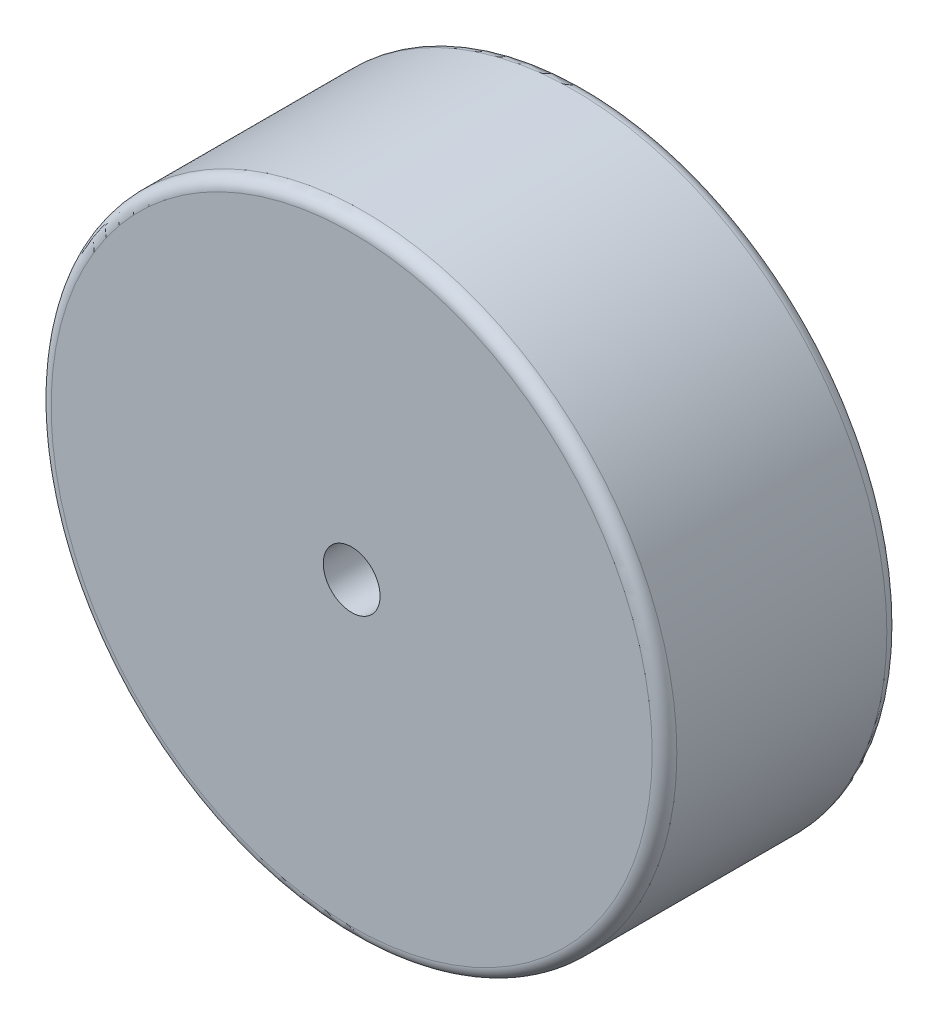
ISO-10303-21;
HEADER;
FILE_DESCRIPTION(('STEP AP214'),'2;1');
FILE_NAME('part.step','',(''),(''),'','','');
FILE_SCHEMA(('AUTOMOTIVE_DESIGN { 1 0 10303 214 1 1 1 1 }'));
ENDSEC;
DATA;
#1=APPLICATION_CONTEXT('core data for automotive mechanical design processes');
#2=APPLICATION_PROTOCOL_DEFINITION('international standard','automotive_design',2000,#1);
#3=PRODUCT_CONTEXT('',#1,'mechanical');
#4=PRODUCT('Part','Part','',(#3));
#5=PRODUCT_RELATED_PRODUCT_CATEGORY('part','',(#4));
#6=PRODUCT_DEFINITION_FORMATION('','',#4);
#7=PRODUCT_DEFINITION_CONTEXT('part definition',#1,'design');
#8=PRODUCT_DEFINITION('design','',#6,#7);
#9=PRODUCT_DEFINITION_SHAPE('','',#8);
#10=(LENGTH_UNIT() NAMED_UNIT(*) SI_UNIT(.MILLI.,.METRE.));
#11=(NAMED_UNIT(*) PLANE_ANGLE_UNIT() SI_UNIT($,.RADIAN.));
#12=(NAMED_UNIT(*) SI_UNIT($,.STERADIAN.) SOLID_ANGLE_UNIT());
#13=UNCERTAINTY_MEASURE_WITH_UNIT(LENGTH_MEASURE(1.E-05),#10,'distance_accuracy_value','');
#14=(GEOMETRIC_REPRESENTATION_CONTEXT(3) GLOBAL_UNCERTAINTY_ASSIGNED_CONTEXT((#13)) GLOBAL_UNIT_ASSIGNED_CONTEXT((#10,
#11,#12)) REPRESENTATION_CONTEXT('',''));
#15=CARTESIAN_POINT('',(0.,0.,0.));
#16=DIRECTION('',(0.,0.,1.));
#17=DIRECTION('',(1.,0.,0.));
#18=AXIS2_PLACEMENT_3D('',#15,#16,#17);
#19=CARTESIAN_POINT('',(0.,0.,9.525));
#20=DIRECTION('',(0.,0.,-1.));
#21=DIRECTION('',(-1.,0.,0.));
#22=AXIS2_PLACEMENT_3D('',#19,#20,#21);
#23=CYLINDRICAL_SURFACE('',#22,25.4);
#24=CARTESIAN_POINT('',(0.,0.,-8.525));
#25=DIRECTION('',(0.,0.,1.));
#26=DIRECTION('',(1.,0.,0.));
#27=AXIS2_PLACEMENT_3D('',#24,#25,#26);
#28=CIRCLE('',#27,25.4);
#29=CARTESIAN_POINT('',(-25.4,0.,-8.52500000000001));
#30=VERTEX_POINT('',#29);
#31=EDGE_CURVE('E56',#30,#30,#28,.T.);
#32=CARTESIAN_POINT('',(0.,0.,8.525));
#33=DIRECTION('',(0.,0.,1.));
#34=DIRECTION('',(1.,0.,0.));
#35=AXIS2_PLACEMENT_3D('',#32,#33,#34);
#36=CIRCLE('',#35,25.4);
#37=CARTESIAN_POINT('',(-25.4,0.,8.525));
#38=VERTEX_POINT('',#37);
#39=EDGE_CURVE('E61',#38,#38,#36,.F.);
#40=CARTESIAN_POINT('',(-25.4,0.,-8.52500000000001));
#41=CARTESIAN_POINT('',(-25.4,0.,-8.34739583333334));
#42=CARTESIAN_POINT('',(-25.4,0.,-8.16979166666667));
#43=CARTESIAN_POINT('',(-25.4,0.,-7.81458333333334));
#44=CARTESIAN_POINT('',(-25.4,0.,-7.63697916666667));
#45=CARTESIAN_POINT('',(-25.4,0.,-7.28177083333334));
#46=CARTESIAN_POINT('',(-25.4,0.,-7.10416666666667));
#47=CARTESIAN_POINT('',(-25.4,0.,-6.74895833333334));
#48=CARTESIAN_POINT('',(-25.4,0.,-6.57135416666667));
#49=CARTESIAN_POINT('',(-25.4,0.,-6.21614583333334));
#50=CARTESIAN_POINT('',(-25.4,0.,-6.03854166666667));
#51=CARTESIAN_POINT('',(-25.4,0.,-5.68333333333334));
#52=CARTESIAN_POINT('',(-25.4,0.,-5.50572916666667));
#53=CARTESIAN_POINT('',(-25.4,0.,-5.15052083333334));
#54=CARTESIAN_POINT('',(-25.4,0.,-4.97291666666667));
#55=CARTESIAN_POINT('',(-25.4,0.,-4.61770833333334));
#56=CARTESIAN_POINT('',(-25.4,0.,-4.44010416666667));
#57=CARTESIAN_POINT('',(-25.4,0.,-4.08489583333334));
#58=CARTESIAN_POINT('',(-25.4,0.,-3.90729166666667));
#59=CARTESIAN_POINT('',(-25.4,0.,-3.55208333333334));
#60=CARTESIAN_POINT('',(-25.4,0.,-3.37447916666667));
#61=CARTESIAN_POINT('',(-25.4,0.,-3.01927083333334));
#62=CARTESIAN_POINT('',(-25.4,0.,-2.84166666666667));
#63=CARTESIAN_POINT('',(-25.4,0.,-2.48645833333334));
#64=CARTESIAN_POINT('',(-25.4,0.,-2.30885416666667));
#65=CARTESIAN_POINT('',(-25.4,0.,-1.95364583333334));
#66=CARTESIAN_POINT('',(-25.4,0.,-1.77604166666667));
#67=CARTESIAN_POINT('',(-25.4,0.,-1.42083333333334));
#68=CARTESIAN_POINT('',(-25.4,0.,-1.24322916666667));
#69=CARTESIAN_POINT('',(-25.4,0.,-0.888020833333337));
#70=CARTESIAN_POINT('',(-25.4,0.,-0.71041666666667));
#71=CARTESIAN_POINT('',(-25.4,0.,-0.355208333333337));
#72=CARTESIAN_POINT('',(-25.4,0.,-0.17760416666667));
#73=CARTESIAN_POINT('',(-25.4,0.,0.177604166666663));
#74=CARTESIAN_POINT('',(-25.4,0.,0.35520833333333));
#75=CARTESIAN_POINT('',(-25.4,0.,0.710416666666664));
#76=CARTESIAN_POINT('',(-25.4,0.,0.88802083333333));
#77=CARTESIAN_POINT('',(-25.4,0.,1.24322916666666));
#78=CARTESIAN_POINT('',(-25.4,0.,1.42083333333333));
#79=CARTESIAN_POINT('',(-25.4,0.,1.77604166666666));
#80=CARTESIAN_POINT('',(-25.4,0.,1.95364583333333));
#81=CARTESIAN_POINT('',(-25.4,0.,2.30885416666666));
#82=CARTESIAN_POINT('',(-25.4,0.,2.48645833333333));
#83=CARTESIAN_POINT('',(-25.4,0.,2.84166666666666));
#84=CARTESIAN_POINT('',(-25.4,0.,3.01927083333333));
#85=CARTESIAN_POINT('',(-25.4,0.,3.37447916666666));
#86=CARTESIAN_POINT('',(-25.4,0.,3.55208333333333));
#87=CARTESIAN_POINT('',(-25.4,0.,3.90729166666666));
#88=CARTESIAN_POINT('',(-25.4,0.,4.08489583333333));
#89=CARTESIAN_POINT('',(-25.4,0.,4.44010416666667));
#90=CARTESIAN_POINT('',(-25.4,0.,4.61770833333333));
#91=CARTESIAN_POINT('',(-25.4,0.,4.97291666666667));
#92=CARTESIAN_POINT('',(-25.4,0.,5.15052083333333));
#93=CARTESIAN_POINT('',(-25.4,0.,5.50572916666667));
#94=CARTESIAN_POINT('',(-25.4,0.,5.68333333333333));
#95=CARTESIAN_POINT('',(-25.4,0.,6.03854166666667));
#96=CARTESIAN_POINT('',(-25.4,0.,6.21614583333333));
#97=CARTESIAN_POINT('',(-25.4,0.,6.57135416666667));
#98=CARTESIAN_POINT('',(-25.4,0.,6.74895833333333));
#99=CARTESIAN_POINT('',(-25.4,0.,7.10416666666667));
#100=CARTESIAN_POINT('',(-25.4,0.,7.28177083333333));
#101=CARTESIAN_POINT('',(-25.4,0.,7.63697916666667));
#102=CARTESIAN_POINT('',(-25.4,0.,7.81458333333333));
#103=CARTESIAN_POINT('',(-25.4,0.,8.16979166666667));
#104=CARTESIAN_POINT('',(-25.4,0.,8.34739583333333));
#105=CARTESIAN_POINT('',(-25.4,0.,8.525));
#106=B_SPLINE_CURVE_WITH_KNOTS('',3,(#40,#41,#42,#43,#44,#45,#46,#47,#48,#49,#50,#51,#52,#53,
#54,#55,#56,#57,#58,#59,#60,#61,#62,#63,#64,#65,#66,#67,#68,#69,#70,#71,#72,#73,#74,#75,#76,#77,
#78,#79,#80,#81,#82,#83,#84,#85,#86,#87,#88,#89,#90,#91,#92,#93,#94,#95,#96,#97,#98,#99,#100,
#101,#102,#103,#104,#105),.UNSPECIFIED.,.F.,.F.,(4,2,2,2,2,2,2,2,2,2,2,2,2,2,2,2,2,2,2,2,2,2,2,
2,2,2,2,2,2,2,2,2,4),(0.,0.5328125,1.065625,1.5984375,2.13125,2.6640625,3.196875,3.7296875,
4.2625,4.7953125,5.328125,5.8609375,6.39375,6.9265625,7.459375,7.9921875,8.525,9.0578125,
9.590625,10.1234375,10.65625,11.1890625,11.721875,12.2546875,12.7875,13.3203125,13.853125,
14.3859375,14.91875,15.4515625,15.984375,16.5171875,17.05),.UNSPECIFIED.);
#107=EDGE_CURVE('BSEAM43',#30,#38,#106,.T.);
#108=ORIENTED_EDGE('',*,*,#31,.T.);
#109=ORIENTED_EDGE('',*,*,#39,.T.);
#110=ORIENTED_EDGE('',*,*,#107,.T.);
#111=ORIENTED_EDGE('',*,*,#107,.F.);
#112=EDGE_LOOP('',(#108,#110,#109,#111));
#113=FACE_BOUND('',#112,.T.);
#114=ADVANCED_FACE('F43',(#113),#23,.T.);
#115=CARTESIAN_POINT('',(0.,0.,9.525));
#116=DIRECTION('',(0.,0.,1.));
#117=DIRECTION('',(1.,0.,0.));
#118=AXIS2_PLACEMENT_3D('',#115,#116,#117);
#119=PLANE('',#118);
#120=CARTESIAN_POINT('',(0.,0.,9.525));
#121=DIRECTION('',(0.,0.,1.));
#122=DIRECTION('',(1.,0.,0.));
#123=AXIS2_PLACEMENT_3D('',#120,#121,#122);
#124=CIRCLE('',#123,2.305);
#125=CARTESIAN_POINT('',(2.305,0.,9.525));
#126=VERTEX_POINT('',#125);
#127=EDGE_CURVE('E68',#126,#126,#124,.T.);
#128=ORIENTED_EDGE('',*,*,#127,.F.);
#129=EDGE_LOOP('',(#128));
#130=FACE_BOUND('',#129,.T.);
#131=CARTESIAN_POINT('',(0.,0.,9.525));
#132=DIRECTION('',(0.,0.,1.));
#133=DIRECTION('',(1.,0.,0.));
#134=AXIS2_PLACEMENT_3D('',#131,#132,#133);
#135=CIRCLE('',#134,24.4);
#136=CARTESIAN_POINT('',(24.4,0.,9.525));
#137=VERTEX_POINT('',#136);
#138=EDGE_CURVE('E10',#137,#137,#135,.T.);
#139=ORIENTED_EDGE('',*,*,#138,.T.);
#140=EDGE_LOOP('',(#139));
#141=FACE_BOUND('',#140,.T.);
#142=ADVANCED_FACE('F84',(#130,#141),#119,.T.);
#143=CARTESIAN_POINT('',(0.,0.,-9.525));
#144=DIRECTION('',(0.,0.,1.));
#145=DIRECTION('',(1.,0.,0.));
#146=AXIS2_PLACEMENT_3D('',#143,#144,#145);
#147=PLANE('',#146);
#148=CARTESIAN_POINT('',(0.,0.,-9.525));
#149=DIRECTION('',(0.,0.,1.));
#150=DIRECTION('',(1.,0.,0.));
#151=AXIS2_PLACEMENT_3D('',#148,#149,#150);
#152=CIRCLE('',#151,24.4);
#153=CARTESIAN_POINT('',(24.4,0.,-9.525));
#154=VERTEX_POINT('',#153);
#155=EDGE_CURVE('E51',#154,#154,#152,.F.);
#156=ORIENTED_EDGE('',*,*,#155,.T.);
#157=EDGE_LOOP('',(#156));
#158=FACE_BOUND('',#157,.T.);
#159=ADVANCED_FACE('F86',(#158),#147,.F.);
#160=CARTESIAN_POINT('',(0.,0.,-8.525));
#161=DIRECTION('',(0.,0.,1.));
#162=DIRECTION('',(1.,0.,0.));
#163=AXIS2_PLACEMENT_3D('',#160,#161,#162);
#164=TOROIDAL_SURFACE('',#163,24.4,1.);
#165=ORIENTED_EDGE('',*,*,#155,.F.);
#166=EDGE_LOOP('',(#165));
#167=FACE_BOUND('',#166,.T.);
#168=ORIENTED_EDGE('',*,*,#31,.F.);
#169=EDGE_LOOP('',(#168));
#170=FACE_BOUND('',#169,.T.);
#171=ADVANCED_FACE('F92',(#167,#170),#164,.T.);
#172=CARTESIAN_POINT('',(0.,0.,8.525));
#173=DIRECTION('',(0.,0.,1.));
#174=DIRECTION('',(1.,0.,0.));
#175=AXIS2_PLACEMENT_3D('',#172,#173,#174);
#176=TOROIDAL_SURFACE('',#175,24.4,1.);
#177=ORIENTED_EDGE('',*,*,#39,.F.);
#178=EDGE_LOOP('',(#177));
#179=FACE_BOUND('',#178,.T.);
#180=ORIENTED_EDGE('',*,*,#138,.F.);
#181=EDGE_LOOP('',(#180));
#182=FACE_BOUND('',#181,.T.);
#183=ADVANCED_FACE('F45',(#179,#182),#176,.T.);
#184=CARTESIAN_POINT('',(0.,0.,-5.475));
#185=DIRECTION('',(0.,0.,1.));
#186=DIRECTION('',(1.,0.,0.));
#187=AXIS2_PLACEMENT_3D('',#184,#185,#186);
#188=CYLINDRICAL_SURFACE('',#187,2.305);
#189=CARTESIAN_POINT('',(0.,0.,-5.475));
#190=DIRECTION('',(0.,0.,1.));
#191=DIRECTION('',(1.,0.,0.));
#192=AXIS2_PLACEMENT_3D('',#189,#190,#191);
#193=CIRCLE('',#192,2.305);
#194=CARTESIAN_POINT('',(2.305,0.,-5.475));
#195=VERTEX_POINT('',#194);
#196=EDGE_CURVE('E67',#195,#195,#193,.T.);
#197=ORIENTED_EDGE('',*,*,#196,.F.);
#198=EDGE_LOOP('',(#197));
#199=FACE_BOUND('',#198,.T.);
#200=ORIENTED_EDGE('',*,*,#127,.T.);
#201=EDGE_LOOP('',(#200));
#202=FACE_BOUND('',#201,.T.);
#203=ADVANCED_FACE('F78',(#199,#202),#188,.F.);
#204=CARTESIAN_POINT('',(0.,0.,-5.475));
#205=DIRECTION('',(0.,0.,1.));
#206=DIRECTION('',(1.,0.,0.));
#207=AXIS2_PLACEMENT_3D('',#204,#205,#206);
#208=PLANE('',#207);
#209=ORIENTED_EDGE('',*,*,#196,.T.);
#210=EDGE_LOOP('',(#209));
#211=FACE_BOUND('',#210,.T.);
#212=ADVANCED_FACE('F76',(#211),#208,.T.);
#213=CLOSED_SHELL('',(#114,#142,#159,#171,#183,#203,#212));
#214=MANIFOLD_SOLID_BREP('B2',#213);
#215=ADVANCED_BREP_SHAPE_REPRESENTATION('',(#18,#214),#14);
#216=SHAPE_DEFINITION_REPRESENTATION(#9,#215);
ENDSEC;
END-ISO-10303-21;
